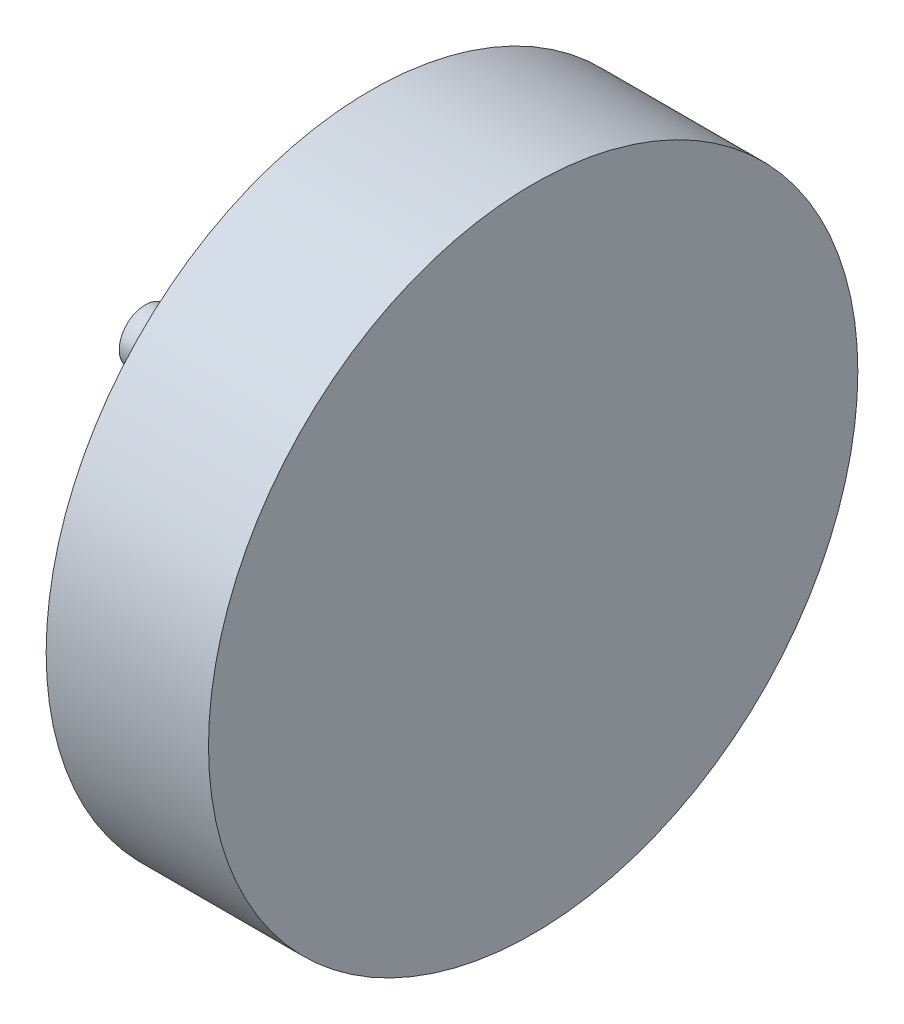
ISO-10303-21;
HEADER;
FILE_DESCRIPTION(('STEP AP214'),'2;1');
FILE_NAME('part.step','',(''),(''),'','','');
FILE_SCHEMA(('AUTOMOTIVE_DESIGN { 1 0 10303 214 1 1 1 1 }'));
ENDSEC;
DATA;
#1=APPLICATION_CONTEXT('core data for automotive mechanical design processes');
#2=APPLICATION_PROTOCOL_DEFINITION('international standard','automotive_design',2000,#1);
#3=PRODUCT_CONTEXT('',#1,'mechanical');
#4=PRODUCT('Part','Part','',(#3));
#5=PRODUCT_RELATED_PRODUCT_CATEGORY('part','',(#4));
#6=PRODUCT_DEFINITION_FORMATION('','',#4);
#7=PRODUCT_DEFINITION_CONTEXT('part definition',#1,'design');
#8=PRODUCT_DEFINITION('design','',#6,#7);
#9=PRODUCT_DEFINITION_SHAPE('','',#8);
#10=(LENGTH_UNIT() NAMED_UNIT(*) SI_UNIT(.MILLI.,.METRE.));
#11=(NAMED_UNIT(*) PLANE_ANGLE_UNIT() SI_UNIT($,.RADIAN.));
#12=(NAMED_UNIT(*) SI_UNIT($,.STERADIAN.) SOLID_ANGLE_UNIT());
#13=UNCERTAINTY_MEASURE_WITH_UNIT(LENGTH_MEASURE(1.E-05),#10,'distance_accuracy_value','');
#14=(GEOMETRIC_REPRESENTATION_CONTEXT(3) GLOBAL_UNCERTAINTY_ASSIGNED_CONTEXT((#13)) GLOBAL_UNIT_ASSIGNED_CONTEXT((#10,
#11,#12)) REPRESENTATION_CONTEXT('',''));
#15=CARTESIAN_POINT('',(0.,0.,0.));
#16=DIRECTION('',(0.,0.,1.));
#17=DIRECTION('',(1.,0.,0.));
#18=AXIS2_PLACEMENT_3D('',#15,#16,#17);
#19=CARTESIAN_POINT('',(45.75,0.,-252.75));
#20=DIRECTION('',(1.,0.,0.));
#21=DIRECTION('',(0.,0.,-1.));
#22=AXIS2_PLACEMENT_3D('',#19,#20,#21);
#23=CYLINDRICAL_SURFACE('',#22,50.);
#24=CARTESIAN_POINT('',(45.75,0.,-252.75));
#25=DIRECTION('',(1.,0.,0.));
#26=DIRECTION('',(0.,0.,-1.));
#27=AXIS2_PLACEMENT_3D('',#24,#25,#26);
#28=CIRCLE('',#27,50.);
#29=CARTESIAN_POINT('',(45.75,0.,-302.75));
#30=VERTEX_POINT('',#29);
#31=EDGE_CURVE('E10',#30,#30,#28,.T.);
#32=ORIENTED_EDGE('',*,*,#31,.T.);
#33=EDGE_LOOP('',(#32));
#34=FACE_BOUND('',#33,.T.);
#35=CARTESIAN_POINT('',(70.75,0.,-252.75));
#36=DIRECTION('',(1.,0.,0.));
#37=DIRECTION('',(0.,0.,-1.));
#38=AXIS2_PLACEMENT_3D('',#35,#36,#37);
#39=CIRCLE('',#38,50.);
#40=CARTESIAN_POINT('',(70.75,0.,-302.75));
#41=VERTEX_POINT('',#40);
#42=EDGE_CURVE('E46',#41,#41,#39,.T.);
#43=ORIENTED_EDGE('',*,*,#42,.F.);
#44=EDGE_LOOP('',(#43));
#45=FACE_BOUND('',#44,.T.);
#46=ADVANCED_FACE('F43',(#34,#45),#23,.T.);
#47=CARTESIAN_POINT('',(45.75,0.,-252.75));
#48=DIRECTION('',(1.,0.,0.));
#49=DIRECTION('',(0.,0.,-1.));
#50=AXIS2_PLACEMENT_3D('',#47,#48,#49);
#51=PLANE('',#50);
#52=CARTESIAN_POINT('',(45.75,0.,-252.75));
#53=DIRECTION('',(1.,0.,0.));
#54=DIRECTION('',(0.,0.,-1.));
#55=AXIS2_PLACEMENT_3D('',#52,#53,#54);
#56=CIRCLE('',#55,3.99999999999999);
#57=CARTESIAN_POINT('',(45.75,0.,-256.75));
#58=VERTEX_POINT('',#57);
#59=EDGE_CURVE('E55',#58,#58,#56,.T.);
#60=ORIENTED_EDGE('',*,*,#59,.T.);
#61=EDGE_LOOP('',(#60));
#62=FACE_BOUND('',#61,.T.);
#63=ORIENTED_EDGE('',*,*,#31,.F.);
#64=EDGE_LOOP('',(#63));
#65=FACE_BOUND('',#64,.T.);
#66=ADVANCED_FACE('F77',(#62,#65),#51,.F.);
#67=CARTESIAN_POINT('',(70.75,0.,-252.75));
#68=DIRECTION('',(1.,0.,0.));
#69=DIRECTION('',(0.,0.,-1.));
#70=AXIS2_PLACEMENT_3D('',#67,#68,#69);
#71=PLANE('',#70);
#72=ORIENTED_EDGE('',*,*,#42,.T.);
#73=EDGE_LOOP('',(#72));
#74=FACE_BOUND('',#73,.T.);
#75=ADVANCED_FACE('F74',(#74),#71,.T.);
#76=CARTESIAN_POINT('',(11.,0.,-252.75));
#77=DIRECTION('',(1.,0.,0.));
#78=DIRECTION('',(0.,0.,-1.));
#79=AXIS2_PLACEMENT_3D('',#76,#77,#78);
#80=CYLINDRICAL_SURFACE('',#79,3.99999999999999);
#81=CARTESIAN_POINT('',(11.,0.,-252.75));
#82=DIRECTION('',(1.,0.,0.));
#83=DIRECTION('',(0.,0.,-1.));
#84=AXIS2_PLACEMENT_3D('',#81,#82,#83);
#85=CIRCLE('',#84,3.99999999999999);
#86=CARTESIAN_POINT('',(11.,0.,-256.75));
#87=VERTEX_POINT('',#86);
#88=EDGE_CURVE('E60',#87,#87,#85,.T.);
#89=CARTESIAN_POINT('',(11.,0.,-256.75));
#90=CARTESIAN_POINT('',(11.3619791666667,0.,-256.75));
#91=CARTESIAN_POINT('',(11.7239583333333,0.,-256.75));
#92=CARTESIAN_POINT('',(12.4479166666667,0.,-256.75));
#93=CARTESIAN_POINT('',(12.8098958333333,0.,-256.75));
#94=CARTESIAN_POINT('',(13.5338541666667,0.,-256.75));
#95=CARTESIAN_POINT('',(13.8958333333333,0.,-256.75));
#96=CARTESIAN_POINT('',(14.6197916666667,0.,-256.75));
#97=CARTESIAN_POINT('',(14.9817708333333,0.,-256.75));
#98=CARTESIAN_POINT('',(15.7057291666667,0.,-256.75));
#99=CARTESIAN_POINT('',(16.0677083333333,0.,-256.75));
#100=CARTESIAN_POINT('',(16.7916666666667,0.,-256.75));
#101=CARTESIAN_POINT('',(17.1536458333333,0.,-256.75));
#102=CARTESIAN_POINT('',(17.8776041666667,0.,-256.75));
#103=CARTESIAN_POINT('',(18.2395833333333,0.,-256.75));
#104=CARTESIAN_POINT('',(18.9635416666667,0.,-256.75));
#105=CARTESIAN_POINT('',(19.3255208333333,0.,-256.75));
#106=CARTESIAN_POINT('',(20.0494791666667,0.,-256.75));
#107=CARTESIAN_POINT('',(20.4114583333333,0.,-256.75));
#108=CARTESIAN_POINT('',(21.1354166666667,0.,-256.75));
#109=CARTESIAN_POINT('',(21.4973958333333,0.,-256.75));
#110=CARTESIAN_POINT('',(22.2213541666667,0.,-256.75));
#111=CARTESIAN_POINT('',(22.5833333333333,0.,-256.75));
#112=CARTESIAN_POINT('',(23.3072916666667,0.,-256.75));
#113=CARTESIAN_POINT('',(23.6692708333333,0.,-256.75));
#114=CARTESIAN_POINT('',(24.3932291666667,0.,-256.75));
#115=CARTESIAN_POINT('',(24.7552083333333,0.,-256.75));
#116=CARTESIAN_POINT('',(25.4791666666667,0.,-256.75));
#117=CARTESIAN_POINT('',(25.8411458333333,0.,-256.75));
#118=CARTESIAN_POINT('',(26.5651041666667,0.,-256.75));
#119=CARTESIAN_POINT('',(26.9270833333333,0.,-256.75));
#120=CARTESIAN_POINT('',(27.6510416666667,0.,-256.75));
#121=CARTESIAN_POINT('',(28.0130208333333,0.,-256.75));
#122=CARTESIAN_POINT('',(28.7369791666667,0.,-256.75));
#123=CARTESIAN_POINT('',(29.0989583333333,0.,-256.75));
#124=CARTESIAN_POINT('',(29.8229166666667,0.,-256.75));
#125=CARTESIAN_POINT('',(30.1848958333333,0.,-256.75));
#126=CARTESIAN_POINT('',(30.9088541666667,0.,-256.75));
#127=CARTESIAN_POINT('',(31.2708333333333,0.,-256.75));
#128=CARTESIAN_POINT('',(31.9947916666667,0.,-256.75));
#129=CARTESIAN_POINT('',(32.3567708333333,0.,-256.75));
#130=CARTESIAN_POINT('',(33.0807291666667,0.,-256.75));
#131=CARTESIAN_POINT('',(33.4427083333333,0.,-256.75));
#132=CARTESIAN_POINT('',(34.1666666666667,0.,-256.75));
#133=CARTESIAN_POINT('',(34.5286458333333,0.,-256.75));
#134=CARTESIAN_POINT('',(35.2526041666667,0.,-256.75));
#135=CARTESIAN_POINT('',(35.6145833333333,0.,-256.75));
#136=CARTESIAN_POINT('',(36.3385416666667,0.,-256.75));
#137=CARTESIAN_POINT('',(36.7005208333333,0.,-256.75));
#138=CARTESIAN_POINT('',(37.4244791666667,0.,-256.75));
#139=CARTESIAN_POINT('',(37.7864583333333,0.,-256.75));
#140=CARTESIAN_POINT('',(38.5104166666667,0.,-256.75));
#141=CARTESIAN_POINT('',(38.8723958333333,0.,-256.75));
#142=CARTESIAN_POINT('',(39.5963541666667,0.,-256.75));
#143=CARTESIAN_POINT('',(39.9583333333333,0.,-256.75));
#144=CARTESIAN_POINT('',(40.6822916666667,0.,-256.75));
#145=CARTESIAN_POINT('',(41.0442708333333,0.,-256.75));
#146=CARTESIAN_POINT('',(41.7682291666667,0.,-256.75));
#147=CARTESIAN_POINT('',(42.1302083333333,0.,-256.75));
#148=CARTESIAN_POINT('',(42.8541666666667,0.,-256.75));
#149=CARTESIAN_POINT('',(43.2161458333333,0.,-256.75));
#150=CARTESIAN_POINT('',(43.9401041666667,0.,-256.75));
#151=CARTESIAN_POINT('',(44.3020833333333,0.,-256.75));
#152=CARTESIAN_POINT('',(45.0260416666667,0.,-256.75));
#153=CARTESIAN_POINT('',(45.3880208333333,0.,-256.75));
#154=CARTESIAN_POINT('',(45.75,0.,-256.75));
#155=B_SPLINE_CURVE_WITH_KNOTS('',3,(#89,#90,#91,#92,#93,#94,#95,#96,#97,#98,#99,#100,#101,#102,
#103,#104,#105,#106,#107,#108,#109,#110,#111,#112,#113,#114,#115,#116,#117,#118,#119,#120,#121,
#122,#123,#124,#125,#126,#127,#128,#129,#130,#131,#132,#133,#134,#135,#136,#137,#138,#139,#140,
#141,#142,#143,#144,#145,#146,#147,#148,#149,#150,#151,#152,#153,#154),.UNSPECIFIED.,.F.,.F.,(4,
2,2,2,2,2,2,2,2,2,2,2,2,2,2,2,2,2,2,2,2,2,2,2,2,2,2,2,2,2,2,2,4),(0.,1.0859375,2.171875,
3.2578125,4.34375,5.4296875,6.515625,7.6015625,8.6875,9.7734375,10.859375,11.9453125,13.03125,
14.1171875,15.203125,16.2890625,17.375,18.4609375,19.546875,20.6328125,21.71875,22.8046875,
23.890625,24.9765625,26.0625,27.1484375,28.234375,29.3203125,30.40625,31.4921875,32.578125,
33.6640625,34.75),.UNSPECIFIED.);
#156=EDGE_CURVE('BSEAM65',#87,#58,#155,.T.);
#157=ORIENTED_EDGE('',*,*,#88,.T.);
#158=ORIENTED_EDGE('',*,*,#59,.F.);
#159=ORIENTED_EDGE('',*,*,#156,.T.);
#160=ORIENTED_EDGE('',*,*,#156,.F.);
#161=EDGE_LOOP('',(#157,#159,#158,#160));
#162=FACE_BOUND('',#161,.T.);
#163=ADVANCED_FACE('F65',(#162),#80,.T.);
#164=CARTESIAN_POINT('',(11.,0.,-252.75));
#165=DIRECTION('',(1.,0.,0.));
#166=DIRECTION('',(0.,0.,-1.));
#167=AXIS2_PLACEMENT_3D('',#164,#165,#166);
#168=PLANE('',#167);
#169=ORIENTED_EDGE('',*,*,#88,.F.);
#170=EDGE_LOOP('',(#169));
#171=FACE_BOUND('',#170,.T.);
#172=ADVANCED_FACE('F68',(#171),#168,.F.);
#173=CLOSED_SHELL('',(#46,#66,#75,#163,#172));
#174=MANIFOLD_SOLID_BREP('B2',#173);
#175=ADVANCED_BREP_SHAPE_REPRESENTATION('',(#18,#174),#14);
#176=SHAPE_DEFINITION_REPRESENTATION(#9,#175);
ENDSEC;
END-ISO-10303-21;
